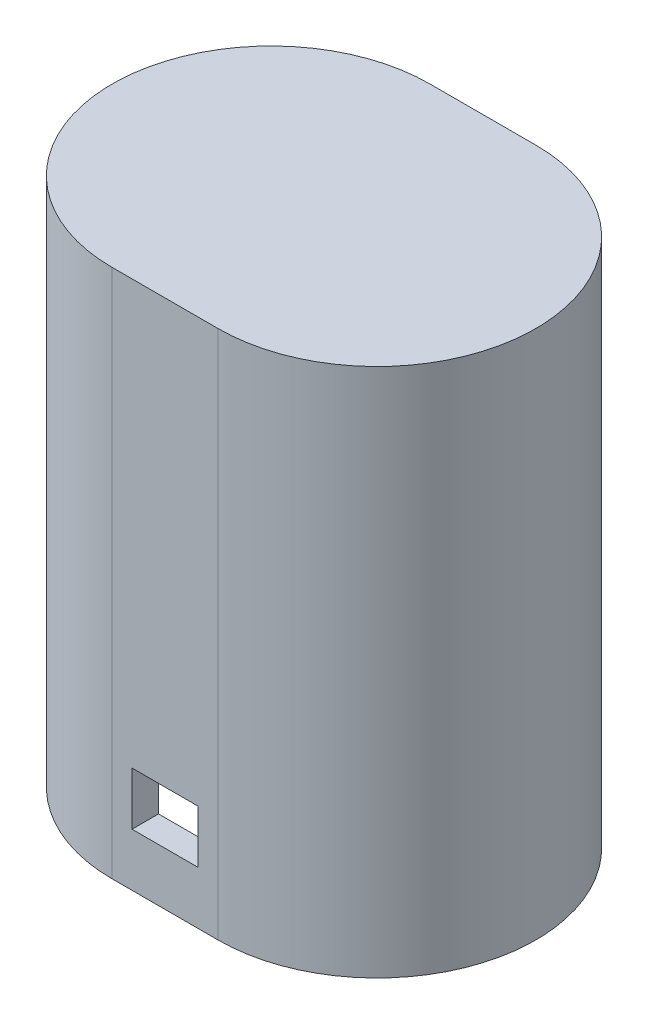
ISO-10303-21;
HEADER;
FILE_DESCRIPTION(('STEP AP214'),'2;1');
FILE_NAME('part.step','',(''),(''),'','','');
FILE_SCHEMA(('AUTOMOTIVE_DESIGN { 1 0 10303 214 1 1 1 1 }'));
ENDSEC;
DATA;
#1=APPLICATION_CONTEXT('core data for automotive mechanical design processes');
#2=APPLICATION_PROTOCOL_DEFINITION('international standard','automotive_design',2000,#1);
#3=PRODUCT_CONTEXT('',#1,'mechanical');
#4=PRODUCT('Part','Part','',(#3));
#5=PRODUCT_RELATED_PRODUCT_CATEGORY('part','',(#4));
#6=PRODUCT_DEFINITION_FORMATION('','',#4);
#7=PRODUCT_DEFINITION_CONTEXT('part definition',#1,'design');
#8=PRODUCT_DEFINITION('design','',#6,#7);
#9=PRODUCT_DEFINITION_SHAPE('','',#8);
#10=(LENGTH_UNIT() NAMED_UNIT(*) SI_UNIT(.MILLI.,.METRE.));
#11=(NAMED_UNIT(*) PLANE_ANGLE_UNIT() SI_UNIT($,.RADIAN.));
#12=(NAMED_UNIT(*) SI_UNIT($,.STERADIAN.) SOLID_ANGLE_UNIT());
#13=UNCERTAINTY_MEASURE_WITH_UNIT(LENGTH_MEASURE(1.E-05),#10,'distance_accuracy_value','');
#14=(GEOMETRIC_REPRESENTATION_CONTEXT(3) GLOBAL_UNCERTAINTY_ASSIGNED_CONTEXT((#13)) GLOBAL_UNIT_ASSIGNED_CONTEXT((#10,
#11,#12)) REPRESENTATION_CONTEXT('',''));
#15=CARTESIAN_POINT('',(0.,0.,0.));
#16=DIRECTION('',(0.,0.,1.));
#17=DIRECTION('',(1.,0.,0.));
#18=AXIS2_PLACEMENT_3D('',#15,#16,#17);
#19=CARTESIAN_POINT('',(-2.,20.,0.));
#20=DIRECTION('',(0.,-1.,0.));
#21=DIRECTION('',(0.,0.,-1.));
#22=AXIS2_PLACEMENT_3D('',#19,#20,#21);
#23=CYLINDRICAL_SURFACE('',#22,6.);
#24=CARTESIAN_POINT('',(-2.,0.,0.));
#25=DIRECTION('',(0.,1.,0.));
#26=DIRECTION('',(0.,0.,1.));
#27=AXIS2_PLACEMENT_3D('',#24,#25,#26);
#28=CIRCLE('',#27,6.);
#29=CARTESIAN_POINT('',(-2.,0.,-6.));
#30=VERTEX_POINT('',#29);
#31=CARTESIAN_POINT('',(-2.,0.,6.));
#32=VERTEX_POINT('',#31);
#33=EDGE_CURVE('E210',#30,#32,#28,.T.);
#34=ORIENTED_EDGE('',*,*,#33,.T.);
#35=DIRECTION('',(0.,-1.,0.));
#36=VECTOR('',#35,1.);
#37=CARTESIAN_POINT('',(-2.,20.,6.));
#38=LINE('',#37,#36);
#39=CARTESIAN_POINT('',(-2.,20.,6.));
#40=VERTEX_POINT('',#39);
#41=EDGE_CURVE('E264',#40,#32,#38,.T.);
#42=ORIENTED_EDGE('',*,*,#41,.F.);
#43=CARTESIAN_POINT('',(-2.,20.,0.));
#44=DIRECTION('',(0.,1.,0.));
#45=DIRECTION('',(0.,0.,1.));
#46=AXIS2_PLACEMENT_3D('',#43,#44,#45);
#47=CIRCLE('',#46,6.);
#48=CARTESIAN_POINT('',(-2.,20.,-6.));
#49=VERTEX_POINT('',#48);
#50=EDGE_CURVE('E238',#49,#40,#47,.T.);
#51=ORIENTED_EDGE('',*,*,#50,.F.);
#52=DIRECTION('',(0.,-1.,0.));
#53=VECTOR('',#52,1.);
#54=CARTESIAN_POINT('',(-2.,20.,-6.));
#55=LINE('',#54,#53);
#56=EDGE_CURVE('E248',#49,#30,#55,.T.);
#57=ORIENTED_EDGE('',*,*,#56,.T.);
#58=EDGE_LOOP('',(#34,#42,#51,#57));
#59=FACE_BOUND('',#58,.T.);
#60=ADVANCED_FACE('F39',(#59),#23,.T.);
#61=CARTESIAN_POINT('',(-2.,20.,6.));
#62=DIRECTION('',(0.,0.,-1.));
#63=DIRECTION('',(-1.,0.,0.));
#64=AXIS2_PLACEMENT_3D('',#61,#62,#63);
#65=PLANE('',#64);
#66=DIRECTION('',(-1.,0.,0.));
#67=VECTOR('',#66,1.);
#68=CARTESIAN_POINT('',(-2.,2.,6.));
#69=LINE('',#68,#67);
#70=CARTESIAN_POINT('',(1.25,2.,6.));
#71=VERTEX_POINT('',#70);
#72=CARTESIAN_POINT('',(-1.25,2.,6.));
#73=VERTEX_POINT('',#72);
#74=EDGE_CURVE('E187',#71,#73,#69,.T.);
#75=ORIENTED_EDGE('',*,*,#74,.T.);
#76=DIRECTION('',(0.,1.,0.));
#77=VECTOR('',#76,1.);
#78=CARTESIAN_POINT('',(-1.25,20.,6.));
#79=LINE('',#78,#77);
#80=CARTESIAN_POINT('',(-1.25,4.,6.));
#81=VERTEX_POINT('',#80);
#82=EDGE_CURVE('E203',#73,#81,#79,.T.);
#83=ORIENTED_EDGE('',*,*,#82,.T.);
#84=DIRECTION('',(1.,0.,0.));
#85=VECTOR('',#84,1.);
#86=CARTESIAN_POINT('',(-2.,4.,6.));
#87=LINE('',#86,#85);
#88=CARTESIAN_POINT('',(1.25,4.,6.));
#89=VERTEX_POINT('',#88);
#90=EDGE_CURVE('E198',#81,#89,#87,.T.);
#91=ORIENTED_EDGE('',*,*,#90,.T.);
#92=DIRECTION('',(0.,-1.,0.));
#93=VECTOR('',#92,1.);
#94=CARTESIAN_POINT('',(1.25,20.,6.));
#95=LINE('',#94,#93);
#96=EDGE_CURVE('E193',#89,#71,#95,.T.);
#97=ORIENTED_EDGE('',*,*,#96,.T.);
#98=EDGE_LOOP('',(#75,#83,#91,#97));
#99=FACE_BOUND('',#98,.T.);
#100=DIRECTION('',(1.,0.,0.));
#101=VECTOR('',#100,1.);
#102=CARTESIAN_POINT('',(-2.,0.,6.));
#103=LINE('',#102,#101);
#104=CARTESIAN_POINT('',(2.,0.,6.));
#105=VERTEX_POINT('',#104);
#106=EDGE_CURVE('E251',#32,#105,#103,.T.);
#107=ORIENTED_EDGE('',*,*,#106,.T.);
#108=DIRECTION('',(0.,-1.,0.));
#109=VECTOR('',#108,1.);
#110=CARTESIAN_POINT('',(2.,20.,6.));
#111=LINE('',#110,#109);
#112=CARTESIAN_POINT('',(2.,20.,6.));
#113=VERTEX_POINT('',#112);
#114=EDGE_CURVE('E261',#113,#105,#111,.T.);
#115=ORIENTED_EDGE('',*,*,#114,.F.);
#116=DIRECTION('',(1.,0.,0.));
#117=VECTOR('',#116,1.);
#118=CARTESIAN_POINT('',(-2.,20.,6.));
#119=LINE('',#118,#117);
#120=EDGE_CURVE('E241',#40,#113,#119,.T.);
#121=ORIENTED_EDGE('',*,*,#120,.F.);
#122=ORIENTED_EDGE('',*,*,#41,.T.);
#123=EDGE_LOOP('',(#107,#115,#121,#122));
#124=FACE_BOUND('',#123,.T.);
#125=ADVANCED_FACE('F293',(#99,#124),#65,.F.);
#126=CARTESIAN_POINT('',(2.,20.,0.));
#127=DIRECTION('',(0.,-1.,0.));
#128=DIRECTION('',(0.,0.,-1.));
#129=AXIS2_PLACEMENT_3D('',#126,#127,#128);
#130=CYLINDRICAL_SURFACE('',#129,6.);
#131=CARTESIAN_POINT('',(2.,0.,0.));
#132=DIRECTION('',(0.,1.,0.));
#133=DIRECTION('',(0.,0.,1.));
#134=AXIS2_PLACEMENT_3D('',#131,#132,#133);
#135=CIRCLE('',#134,6.);
#136=CARTESIAN_POINT('',(2.,0.,-6.));
#137=VERTEX_POINT('',#136);
#138=EDGE_CURVE('E253',#105,#137,#135,.T.);
#139=ORIENTED_EDGE('',*,*,#138,.T.);
#140=DIRECTION('',(0.,-1.,0.));
#141=VECTOR('',#140,1.);
#142=CARTESIAN_POINT('',(2.,20.,-6.));
#143=LINE('',#142,#141);
#144=CARTESIAN_POINT('',(2.,20.,-6.));
#145=VERTEX_POINT('',#144);
#146=EDGE_CURVE('E258',#145,#137,#143,.T.);
#147=ORIENTED_EDGE('',*,*,#146,.F.);
#148=CARTESIAN_POINT('',(2.,20.,0.));
#149=DIRECTION('',(0.,1.,0.));
#150=DIRECTION('',(0.,0.,1.));
#151=AXIS2_PLACEMENT_3D('',#148,#149,#150);
#152=CIRCLE('',#151,6.);
#153=EDGE_CURVE('E244',#113,#145,#152,.T.);
#154=ORIENTED_EDGE('',*,*,#153,.F.);
#155=ORIENTED_EDGE('',*,*,#114,.T.);
#156=EDGE_LOOP('',(#139,#147,#154,#155));
#157=FACE_BOUND('',#156,.T.);
#158=ADVANCED_FACE('F298',(#157),#130,.T.);
#159=CARTESIAN_POINT('',(-2.,20.,-6.));
#160=DIRECTION('',(0.,0.,1.));
#161=DIRECTION('',(1.,0.,0.));
#162=AXIS2_PLACEMENT_3D('',#159,#160,#161);
#163=PLANE('',#162);
#164=DIRECTION('',(-1.,0.,0.));
#165=VECTOR('',#164,1.);
#166=CARTESIAN_POINT('',(-1.25,4.,-6.));
#167=LINE('',#166,#165);
#168=CARTESIAN_POINT('',(1.25,4.,-6.));
#169=VERTEX_POINT('',#168);
#170=CARTESIAN_POINT('',(-1.25,4.,-6.));
#171=VERTEX_POINT('',#170);
#172=EDGE_CURVE('E172',#169,#171,#167,.T.);
#173=ORIENTED_EDGE('',*,*,#172,.T.);
#174=DIRECTION('',(0.,-1.,0.));
#175=VECTOR('',#174,1.);
#176=CARTESIAN_POINT('',(-1.25,4.,-6.));
#177=LINE('',#176,#175);
#178=CARTESIAN_POINT('',(-1.25,2.,-6.));
#179=VERTEX_POINT('',#178);
#180=EDGE_CURVE('E156',#171,#179,#177,.T.);
#181=ORIENTED_EDGE('',*,*,#180,.T.);
#182=DIRECTION('',(1.,0.,0.));
#183=VECTOR('',#182,1.);
#184=CARTESIAN_POINT('',(-1.25,2.,-6.));
#185=LINE('',#184,#183);
#186=CARTESIAN_POINT('',(1.25,2.,-6.));
#187=VERTEX_POINT('',#186);
#188=EDGE_CURVE('E164',#179,#187,#185,.T.);
#189=ORIENTED_EDGE('',*,*,#188,.T.);
#190=DIRECTION('',(0.,1.,0.));
#191=VECTOR('',#190,1.);
#192=CARTESIAN_POINT('',(1.25,4.,-6.));
#193=LINE('',#192,#191);
#194=EDGE_CURVE('E61',#187,#169,#193,.T.);
#195=ORIENTED_EDGE('',*,*,#194,.T.);
#196=EDGE_LOOP('',(#173,#181,#189,#195));
#197=FACE_BOUND('',#196,.T.);
#198=DIRECTION('',(-1.,0.,0.));
#199=VECTOR('',#198,1.);
#200=CARTESIAN_POINT('',(-2.,0.,-6.));
#201=LINE('',#200,#199);
#202=EDGE_CURVE('E242',#137,#30,#201,.T.);
#203=ORIENTED_EDGE('',*,*,#202,.T.);
#204=ORIENTED_EDGE('',*,*,#56,.F.);
#205=DIRECTION('',(-1.,0.,0.));
#206=VECTOR('',#205,1.);
#207=CARTESIAN_POINT('',(-2.,20.,-6.));
#208=LINE('',#207,#206);
#209=EDGE_CURVE('E246',#145,#49,#208,.T.);
#210=ORIENTED_EDGE('',*,*,#209,.F.);
#211=ORIENTED_EDGE('',*,*,#146,.T.);
#212=EDGE_LOOP('',(#203,#204,#210,#211));
#213=FACE_BOUND('',#212,.T.);
#214=ADVANCED_FACE('F169',(#197,#213),#163,.F.);
#215=CARTESIAN_POINT('',(-2.,20.,0.));
#216=DIRECTION('',(0.,1.,0.));
#217=DIRECTION('',(0.,0.,1.));
#218=AXIS2_PLACEMENT_3D('',#215,#216,#217);
#219=PLANE('',#218);
#220=ORIENTED_EDGE('',*,*,#50,.T.);
#221=ORIENTED_EDGE('',*,*,#120,.T.);
#222=ORIENTED_EDGE('',*,*,#153,.T.);
#223=ORIENTED_EDGE('',*,*,#209,.T.);
#224=EDGE_LOOP('',(#220,#221,#222,#223));
#225=FACE_BOUND('',#224,.T.);
#226=ADVANCED_FACE('F312',(#225),#219,.T.);
#227=CARTESIAN_POINT('',(-2.,0.,0.));
#228=DIRECTION('',(0.,1.,0.));
#229=DIRECTION('',(0.,0.,1.));
#230=AXIS2_PLACEMENT_3D('',#227,#228,#229);
#231=PLANE('',#230);
#232=DIRECTION('',(-1.,0.,0.));
#233=VECTOR('',#232,1.);
#234=CARTESIAN_POINT('',(-2.,0.,-5.));
#235=LINE('',#234,#233);
#236=CARTESIAN_POINT('',(2.,0.,-5.));
#237=VERTEX_POINT('',#236);
#238=CARTESIAN_POINT('',(-2.,0.,-5.));
#239=VERTEX_POINT('',#238);
#240=EDGE_CURVE('E216',#237,#239,#235,.T.);
#241=ORIENTED_EDGE('',*,*,#240,.T.);
#242=CARTESIAN_POINT('',(-2.,0.,0.));
#243=DIRECTION('',(0.,1.,0.));
#244=DIRECTION('',(0.,0.,1.));
#245=AXIS2_PLACEMENT_3D('',#242,#243,#244);
#246=CIRCLE('',#245,5.);
#247=CARTESIAN_POINT('',(-2.,0.,5.));
#248=VERTEX_POINT('',#247);
#249=EDGE_CURVE('E206',#239,#248,#246,.T.);
#250=ORIENTED_EDGE('',*,*,#249,.T.);
#251=DIRECTION('',(1.,0.,0.));
#252=VECTOR('',#251,1.);
#253=CARTESIAN_POINT('',(-2.,0.,5.));
#254=LINE('',#253,#252);
#255=CARTESIAN_POINT('',(2.,0.,5.));
#256=VERTEX_POINT('',#255);
#257=EDGE_CURVE('E230',#248,#256,#254,.T.);
#258=ORIENTED_EDGE('',*,*,#257,.T.);
#259=CARTESIAN_POINT('',(2.,0.,0.));
#260=DIRECTION('',(0.,1.,0.));
#261=DIRECTION('',(0.,0.,1.));
#262=AXIS2_PLACEMENT_3D('',#259,#260,#261);
#263=CIRCLE('',#262,5.);
#264=EDGE_CURVE('E233',#256,#237,#263,.T.);
#265=ORIENTED_EDGE('',*,*,#264,.T.);
#266=EDGE_LOOP('',(#241,#250,#258,#265));
#267=FACE_BOUND('',#266,.T.);
#268=ORIENTED_EDGE('',*,*,#33,.F.);
#269=ORIENTED_EDGE('',*,*,#202,.F.);
#270=ORIENTED_EDGE('',*,*,#138,.F.);
#271=ORIENTED_EDGE('',*,*,#106,.F.);
#272=EDGE_LOOP('',(#268,#269,#270,#271));
#273=FACE_BOUND('',#272,.T.);
#274=ADVANCED_FACE('F306',(#267,#273),#231,.F.);
#275=CARTESIAN_POINT('',(-2.,20.,0.));
#276=DIRECTION('',(0.,-1.,0.));
#277=DIRECTION('',(0.,0.,-1.));
#278=AXIS2_PLACEMENT_3D('',#275,#276,#277);
#279=CYLINDRICAL_SURFACE('',#278,5.);
#280=ORIENTED_EDGE('',*,*,#249,.F.);
#281=DIRECTION('',(0.,-1.,0.));
#282=VECTOR('',#281,1.);
#283=CARTESIAN_POINT('',(-2.,20.,-5.));
#284=LINE('',#283,#282);
#285=CARTESIAN_POINT('',(-2.,19.,-5.));
#286=VERTEX_POINT('',#285);
#287=EDGE_CURVE('E217',#286,#239,#284,.T.);
#288=ORIENTED_EDGE('',*,*,#287,.F.);
#289=CARTESIAN_POINT('',(-2.,19.,0.));
#290=DIRECTION('',(0.,1.,0.));
#291=DIRECTION('',(0.,0.,1.));
#292=AXIS2_PLACEMENT_3D('',#289,#290,#291);
#293=CIRCLE('',#292,5.);
#294=CARTESIAN_POINT('',(-2.,19.,5.));
#295=VERTEX_POINT('',#294);
#296=EDGE_CURVE('E212',#286,#295,#293,.T.);
#297=ORIENTED_EDGE('',*,*,#296,.T.);
#298=DIRECTION('',(0.,1.,0.));
#299=VECTOR('',#298,1.);
#300=CARTESIAN_POINT('',(-2.,20.,5.));
#301=LINE('',#300,#299);
#302=EDGE_CURVE('E207',#295,#248,#301,.F.);
#303=ORIENTED_EDGE('',*,*,#302,.T.);
#304=EDGE_LOOP('',(#280,#288,#297,#303));
#305=FACE_BOUND('',#304,.T.);
#306=ADVANCED_FACE('F325',(#305),#279,.F.);
#307=CARTESIAN_POINT('',(-2.,20.,5.));
#308=DIRECTION('',(0.,0.,-1.));
#309=DIRECTION('',(-1.,0.,0.));
#310=AXIS2_PLACEMENT_3D('',#307,#308,#309);
#311=PLANE('',#310);
#312=DIRECTION('',(0.,1.,0.));
#313=VECTOR('',#312,1.);
#314=CARTESIAN_POINT('',(-1.25,20.,5.));
#315=LINE('',#314,#313);
#316=CARTESIAN_POINT('',(-1.25,2.,5.));
#317=VERTEX_POINT('',#316);
#318=CARTESIAN_POINT('',(-1.25,4.,5.));
#319=VERTEX_POINT('',#318);
#320=EDGE_CURVE('E201',#317,#319,#315,.T.);
#321=ORIENTED_EDGE('',*,*,#320,.F.);
#322=DIRECTION('',(-1.,0.,0.));
#323=VECTOR('',#322,1.);
#324=CARTESIAN_POINT('',(-2.,2.,5.));
#325=LINE('',#324,#323);
#326=CARTESIAN_POINT('',(1.25,2.,5.));
#327=VERTEX_POINT('',#326);
#328=EDGE_CURVE('E179',#327,#317,#325,.T.);
#329=ORIENTED_EDGE('',*,*,#328,.F.);
#330=DIRECTION('',(0.,-1.,0.));
#331=VECTOR('',#330,1.);
#332=CARTESIAN_POINT('',(1.25,20.,5.));
#333=LINE('',#332,#331);
#334=CARTESIAN_POINT('',(1.25,4.,5.));
#335=VERTEX_POINT('',#334);
#336=EDGE_CURVE('E190',#335,#327,#333,.T.);
#337=ORIENTED_EDGE('',*,*,#336,.F.);
#338=DIRECTION('',(1.,0.,0.));
#339=VECTOR('',#338,1.);
#340=CARTESIAN_POINT('',(-2.,4.,5.));
#341=LINE('',#340,#339);
#342=EDGE_CURVE('E196',#319,#335,#341,.T.);
#343=ORIENTED_EDGE('',*,*,#342,.F.);
#344=EDGE_LOOP('',(#321,#329,#337,#343));
#345=FACE_BOUND('',#344,.T.);
#346=ORIENTED_EDGE('',*,*,#257,.F.);
#347=ORIENTED_EDGE('',*,*,#302,.F.);
#348=DIRECTION('',(1.,0.,0.));
#349=VECTOR('',#348,1.);
#350=CARTESIAN_POINT('',(-2.,19.,5.));
#351=LINE('',#350,#349);
#352=CARTESIAN_POINT('',(2.,19.,5.));
#353=VERTEX_POINT('',#352);
#354=EDGE_CURVE('E215',#295,#353,#351,.T.);
#355=ORIENTED_EDGE('',*,*,#354,.T.);
#356=DIRECTION('',(0.,-1.,0.));
#357=VECTOR('',#356,1.);
#358=CARTESIAN_POINT('',(2.,20.,5.));
#359=LINE('',#358,#357);
#360=EDGE_CURVE('E211',#353,#256,#359,.T.);
#361=ORIENTED_EDGE('',*,*,#360,.T.);
#362=EDGE_LOOP('',(#346,#347,#355,#361));
#363=FACE_BOUND('',#362,.T.);
#364=ADVANCED_FACE('F337',(#345,#363),#311,.T.);
#365=CARTESIAN_POINT('',(2.,20.,0.));
#366=DIRECTION('',(0.,-1.,0.));
#367=DIRECTION('',(0.,0.,-1.));
#368=AXIS2_PLACEMENT_3D('',#365,#366,#367);
#369=CYLINDRICAL_SURFACE('',#368,5.);
#370=ORIENTED_EDGE('',*,*,#264,.F.);
#371=ORIENTED_EDGE('',*,*,#360,.F.);
#372=CARTESIAN_POINT('',(2.,19.,0.));
#373=DIRECTION('',(0.,1.,0.));
#374=DIRECTION('',(0.,0.,1.));
#375=AXIS2_PLACEMENT_3D('',#372,#373,#374);
#376=CIRCLE('',#375,5.);
#377=CARTESIAN_POINT('',(2.,19.,-5.));
#378=VERTEX_POINT('',#377);
#379=EDGE_CURVE('E224',#353,#378,#376,.T.);
#380=ORIENTED_EDGE('',*,*,#379,.T.);
#381=DIRECTION('',(0.,1.,0.));
#382=VECTOR('',#381,1.);
#383=CARTESIAN_POINT('',(2.,20.,-5.));
#384=LINE('',#383,#382);
#385=EDGE_CURVE('E219',#378,#237,#384,.F.);
#386=ORIENTED_EDGE('',*,*,#385,.T.);
#387=EDGE_LOOP('',(#370,#371,#380,#386));
#388=FACE_BOUND('',#387,.T.);
#389=ADVANCED_FACE('F334',(#388),#369,.F.);
#390=CARTESIAN_POINT('',(-2.,20.,-5.));
#391=DIRECTION('',(0.,0.,1.));
#392=DIRECTION('',(1.,0.,0.));
#393=AXIS2_PLACEMENT_3D('',#390,#391,#392);
#394=PLANE('',#393);
#395=DIRECTION('',(0.,-1.,0.));
#396=VECTOR('',#395,1.);
#397=CARTESIAN_POINT('',(-1.25,20.,-5.));
#398=LINE('',#397,#396);
#399=CARTESIAN_POINT('',(-1.25,4.,-5.));
#400=VERTEX_POINT('',#399);
#401=CARTESIAN_POINT('',(-1.25,2.,-5.));
#402=VERTEX_POINT('',#401);
#403=EDGE_CURVE('E11',#400,#402,#398,.T.);
#404=ORIENTED_EDGE('',*,*,#403,.F.);
#405=DIRECTION('',(-1.,0.,0.));
#406=VECTOR('',#405,1.);
#407=CARTESIAN_POINT('',(-2.,4.,-5.));
#408=LINE('',#407,#406);
#409=CARTESIAN_POINT('',(1.25,4.,-5.));
#410=VERTEX_POINT('',#409);
#411=EDGE_CURVE('E46',#410,#400,#408,.T.);
#412=ORIENTED_EDGE('',*,*,#411,.F.);
#413=DIRECTION('',(0.,1.,0.));
#414=VECTOR('',#413,1.);
#415=CARTESIAN_POINT('',(1.25,20.,-5.));
#416=LINE('',#415,#414);
#417=CARTESIAN_POINT('',(1.25,2.,-5.));
#418=VERTEX_POINT('',#417);
#419=EDGE_CURVE('E269',#418,#410,#416,.T.);
#420=ORIENTED_EDGE('',*,*,#419,.F.);
#421=DIRECTION('',(1.,0.,0.));
#422=VECTOR('',#421,1.);
#423=CARTESIAN_POINT('',(-2.,2.,-5.));
#424=LINE('',#423,#422);
#425=EDGE_CURVE('E267',#402,#418,#424,.T.);
#426=ORIENTED_EDGE('',*,*,#425,.F.);
#427=EDGE_LOOP('',(#404,#412,#420,#426));
#428=FACE_BOUND('',#427,.T.);
#429=ORIENTED_EDGE('',*,*,#240,.F.);
#430=ORIENTED_EDGE('',*,*,#385,.F.);
#431=DIRECTION('',(-1.,0.,0.));
#432=VECTOR('',#431,1.);
#433=CARTESIAN_POINT('',(-2.,19.,-5.));
#434=LINE('',#433,#432);
#435=EDGE_CURVE('E220',#378,#286,#434,.T.);
#436=ORIENTED_EDGE('',*,*,#435,.T.);
#437=ORIENTED_EDGE('',*,*,#287,.T.);
#438=EDGE_LOOP('',(#429,#430,#436,#437));
#439=FACE_BOUND('',#438,.T.);
#440=ADVANCED_FACE('F275',(#428,#439),#394,.T.);
#441=CARTESIAN_POINT('',(-2.,19.,0.));
#442=DIRECTION('',(0.,1.,0.));
#443=DIRECTION('',(0.,0.,1.));
#444=AXIS2_PLACEMENT_3D('',#441,#442,#443);
#445=PLANE('',#444);
#446=ORIENTED_EDGE('',*,*,#296,.F.);
#447=ORIENTED_EDGE('',*,*,#435,.F.);
#448=ORIENTED_EDGE('',*,*,#379,.F.);
#449=ORIENTED_EDGE('',*,*,#354,.F.);
#450=EDGE_LOOP('',(#446,#447,#448,#449));
#451=FACE_BOUND('',#450,.T.);
#452=ADVANCED_FACE('F287',(#451),#445,.F.);
#453=CARTESIAN_POINT('',(-1.25,2.,-6.));
#454=DIRECTION('',(0.,-1.,0.));
#455=DIRECTION('',(1.,0.,0.));
#456=AXIS2_PLACEMENT_3D('',#453,#454,#455);
#457=PLANE('',#456);
#458=ORIENTED_EDGE('',*,*,#425,.T.);
#459=DIRECTION('',(0.,0.,1.));
#460=VECTOR('',#459,1.);
#461=CARTESIAN_POINT('',(1.25,2.,-6.));
#462=LINE('',#461,#460);
#463=EDGE_CURVE('E166',#187,#418,#462,.T.);
#464=ORIENTED_EDGE('',*,*,#463,.F.);
#465=ORIENTED_EDGE('',*,*,#188,.F.);
#466=DIRECTION('',(0.,0.,1.));
#467=VECTOR('',#466,1.);
#468=CARTESIAN_POINT('',(-1.25,2.,-6.));
#469=LINE('',#468,#467);
#470=EDGE_CURVE('E151',#179,#402,#469,.T.);
#471=ORIENTED_EDGE('',*,*,#470,.T.);
#472=EDGE_LOOP('',(#458,#464,#465,#471));
#473=FACE_BOUND('',#472,.T.);
#474=ADVANCED_FACE('F165',(#473),#457,.F.);
#475=CARTESIAN_POINT('',(1.25,4.,-6.));
#476=DIRECTION('',(1.,0.,0.));
#477=DIRECTION('',(0.,0.,-1.));
#478=AXIS2_PLACEMENT_3D('',#475,#476,#477);
#479=PLANE('',#478);
#480=ORIENTED_EDGE('',*,*,#419,.T.);
#481=DIRECTION('',(0.,0.,1.));
#482=VECTOR('',#481,1.);
#483=CARTESIAN_POINT('',(1.25,4.,-6.));
#484=LINE('',#483,#482);
#485=EDGE_CURVE('E181',#169,#410,#484,.T.);
#486=ORIENTED_EDGE('',*,*,#485,.F.);
#487=ORIENTED_EDGE('',*,*,#194,.F.);
#488=ORIENTED_EDGE('',*,*,#463,.T.);
#489=EDGE_LOOP('',(#480,#486,#487,#488));
#490=FACE_BOUND('',#489,.T.);
#491=ADVANCED_FACE('F277',(#490),#479,.F.);
#492=CARTESIAN_POINT('',(-1.25,4.,-6.));
#493=DIRECTION('',(0.,1.,0.));
#494=DIRECTION('',(0.,0.,1.));
#495=AXIS2_PLACEMENT_3D('',#492,#493,#494);
#496=PLANE('',#495);
#497=ORIENTED_EDGE('',*,*,#411,.T.);
#498=DIRECTION('',(0.,0.,1.));
#499=VECTOR('',#498,1.);
#500=CARTESIAN_POINT('',(-1.25,4.,-6.));
#501=LINE('',#500,#499);
#502=EDGE_CURVE('E177',#171,#400,#501,.T.);
#503=ORIENTED_EDGE('',*,*,#502,.F.);
#504=ORIENTED_EDGE('',*,*,#172,.F.);
#505=ORIENTED_EDGE('',*,*,#485,.T.);
#506=EDGE_LOOP('',(#497,#503,#504,#505));
#507=FACE_BOUND('',#506,.T.);
#508=ADVANCED_FACE('F272',(#507),#496,.F.);
#509=CARTESIAN_POINT('',(-1.25,4.,-6.));
#510=DIRECTION('',(-1.,0.,0.));
#511=DIRECTION('',(0.,-1.,0.));
#512=AXIS2_PLACEMENT_3D('',#509,#510,#511);
#513=PLANE('',#512);
#514=ORIENTED_EDGE('',*,*,#403,.T.);
#515=ORIENTED_EDGE('',*,*,#470,.F.);
#516=ORIENTED_EDGE('',*,*,#180,.F.);
#517=ORIENTED_EDGE('',*,*,#502,.T.);
#518=EDGE_LOOP('',(#514,#515,#516,#517));
#519=FACE_BOUND('',#518,.T.);
#520=ADVANCED_FACE('F153',(#519),#513,.F.);
#521=EDGE_CURVE('E53',#317,#73,#469,.T.);
#522=ORIENTED_EDGE('',*,*,#521,.F.);
#523=ORIENTED_EDGE('',*,*,#320,.T.);
#524=EDGE_CURVE('E180',#319,#81,#501,.T.);
#525=ORIENTED_EDGE('',*,*,#524,.T.);
#526=ORIENTED_EDGE('',*,*,#82,.F.);
#527=EDGE_LOOP('',(#522,#523,#525,#526));
#528=FACE_BOUND('',#527,.T.);
#529=ADVANCED_FACE('F346',(#528),#513,.F.);
#530=ORIENTED_EDGE('',*,*,#524,.F.);
#531=ORIENTED_EDGE('',*,*,#342,.T.);
#532=EDGE_CURVE('E184',#335,#89,#484,.T.);
#533=ORIENTED_EDGE('',*,*,#532,.T.);
#534=ORIENTED_EDGE('',*,*,#90,.F.);
#535=EDGE_LOOP('',(#530,#531,#533,#534));
#536=FACE_BOUND('',#535,.T.);
#537=ADVANCED_FACE('F286',(#536),#496,.F.);
#538=ORIENTED_EDGE('',*,*,#532,.F.);
#539=ORIENTED_EDGE('',*,*,#336,.T.);
#540=EDGE_CURVE('E161',#327,#71,#462,.T.);
#541=ORIENTED_EDGE('',*,*,#540,.T.);
#542=ORIENTED_EDGE('',*,*,#96,.F.);
#543=EDGE_LOOP('',(#538,#539,#541,#542));
#544=FACE_BOUND('',#543,.T.);
#545=ADVANCED_FACE('F280',(#544),#479,.F.);
#546=ORIENTED_EDGE('',*,*,#540,.F.);
#547=ORIENTED_EDGE('',*,*,#328,.T.);
#548=ORIENTED_EDGE('',*,*,#521,.T.);
#549=ORIENTED_EDGE('',*,*,#74,.F.);
#550=EDGE_LOOP('',(#546,#547,#548,#549));
#551=FACE_BOUND('',#550,.T.);
#552=ADVANCED_FACE('F289',(#551),#457,.F.);
#553=CLOSED_SHELL('',(#60,#125,#158,#214,#226,#274,#306,#364,#389,#440,#452,#474,#491,#508,#520,
#529,#537,#545,#552));
#554=MANIFOLD_SOLID_BREP('B2',#553);
#555=ADVANCED_BREP_SHAPE_REPRESENTATION('',(#18,#554),#14);
#556=SHAPE_DEFINITION_REPRESENTATION(#9,#555);
ENDSEC;
END-ISO-10303-21;
